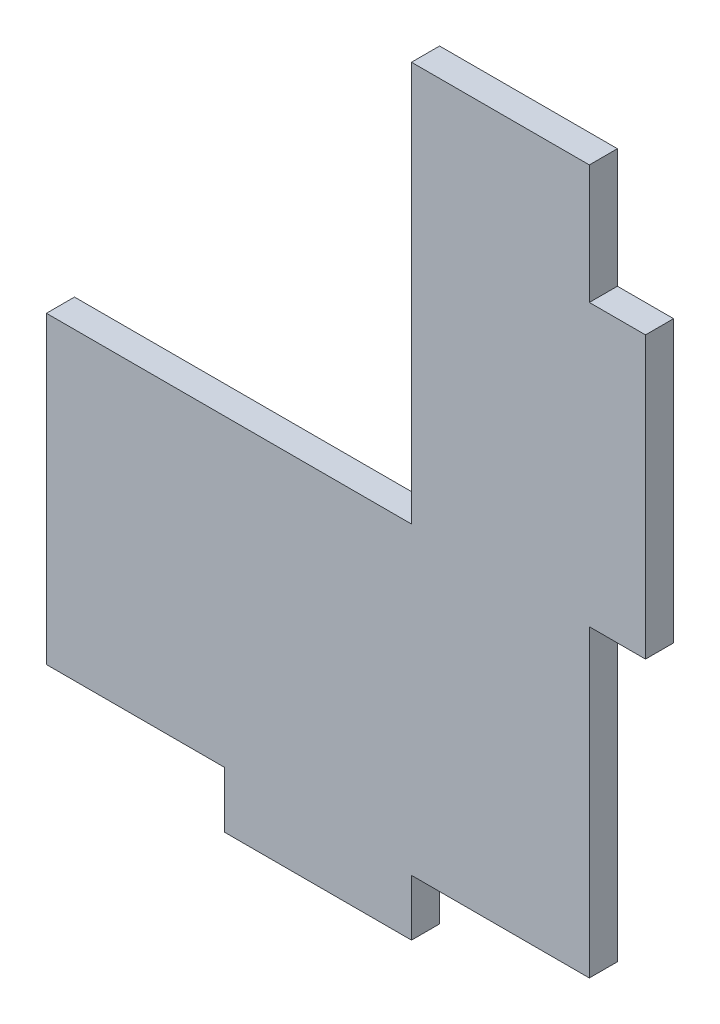
ISO-10303-21;
HEADER;
FILE_DESCRIPTION(('STEP AP214'),'2;1');
FILE_NAME('part.step','',(''),(''),'','','');
FILE_SCHEMA(('AUTOMOTIVE_DESIGN { 1 0 10303 214 1 1 1 1 }'));
ENDSEC;
DATA;
#1=APPLICATION_CONTEXT('core data for automotive mechanical design processes');
#2=APPLICATION_PROTOCOL_DEFINITION('international standard','automotive_design',2000,#1);
#3=PRODUCT_CONTEXT('',#1,'mechanical');
#4=PRODUCT('Part','Part','',(#3));
#5=PRODUCT_RELATED_PRODUCT_CATEGORY('part','',(#4));
#6=PRODUCT_DEFINITION_FORMATION('','',#4);
#7=PRODUCT_DEFINITION_CONTEXT('part definition',#1,'design');
#8=PRODUCT_DEFINITION('design','',#6,#7);
#9=PRODUCT_DEFINITION_SHAPE('','',#8);
#10=(LENGTH_UNIT() NAMED_UNIT(*) SI_UNIT(.MILLI.,.METRE.));
#11=(NAMED_UNIT(*) PLANE_ANGLE_UNIT() SI_UNIT($,.RADIAN.));
#12=(NAMED_UNIT(*) SI_UNIT($,.STERADIAN.) SOLID_ANGLE_UNIT());
#13=UNCERTAINTY_MEASURE_WITH_UNIT(LENGTH_MEASURE(1.E-05),#10,'distance_accuracy_value','');
#14=(GEOMETRIC_REPRESENTATION_CONTEXT(3) GLOBAL_UNCERTAINTY_ASSIGNED_CONTEXT((#13)) GLOBAL_UNIT_ASSIGNED_CONTEXT((#10,
#11,#12)) REPRESENTATION_CONTEXT('',''));
#15=CARTESIAN_POINT('',(0.,0.,0.));
#16=DIRECTION('',(0.,0.,1.));
#17=DIRECTION('',(1.,0.,0.));
#18=AXIS2_PLACEMENT_3D('',#15,#16,#17);
#19=CARTESIAN_POINT('',(0.,0.,3.));
#20=DIRECTION('',(-1.,0.,0.));
#21=DIRECTION('',(0.,0.,1.));
#22=AXIS2_PLACEMENT_3D('',#19,#20,#21);
#23=PLANE('',#22);
#24=DIRECTION('',(0.,1.,0.));
#25=VECTOR('',#24,1.);
#26=CARTESIAN_POINT('',(0.,0.,3.));
#27=LINE('',#26,#25);
#28=CARTESIAN_POINT('',(0.,38.5,3.));
#29=VERTEX_POINT('',#28);
#30=CARTESIAN_POINT('',(0.,68.5,3.));
#31=VERTEX_POINT('',#30);
#32=EDGE_CURVE('E240',#29,#31,#27,.T.);
#33=ORIENTED_EDGE('',*,*,#32,.F.);
#34=DIRECTION('',(0.,0.,-1.));
#35=VECTOR('',#34,1.);
#36=CARTESIAN_POINT('',(0.,38.5,3.));
#37=LINE('',#36,#35);
#38=CARTESIAN_POINT('',(0.,38.5,0.));
#39=VERTEX_POINT('',#38);
#40=EDGE_CURVE('E192',#29,#39,#37,.T.);
#41=ORIENTED_EDGE('',*,*,#40,.T.);
#42=DIRECTION('',(0.,1.,0.));
#43=VECTOR('',#42,1.);
#44=CARTESIAN_POINT('',(0.,0.,0.));
#45=LINE('',#44,#43);
#46=CARTESIAN_POINT('',(0.,68.5,0.));
#47=VERTEX_POINT('',#46);
#48=EDGE_CURVE('E57',#39,#47,#45,.T.);
#49=ORIENTED_EDGE('',*,*,#48,.T.);
#50=DIRECTION('',(0.,0.,-1.));
#51=VECTOR('',#50,1.);
#52=CARTESIAN_POINT('',(0.,68.5,3.));
#53=LINE('',#52,#51);
#54=EDGE_CURVE('E232',#31,#47,#53,.T.);
#55=ORIENTED_EDGE('',*,*,#54,.F.);
#56=EDGE_LOOP('',(#33,#41,#49,#55));
#57=FACE_BOUND('',#56,.T.);
#58=ADVANCED_FACE('F35',(#57),#23,.F.);
#59=CARTESIAN_POINT('',(0.,0.,3.));
#60=DIRECTION('',(0.,1.,0.));
#61=DIRECTION('',(-1.,0.,0.));
#62=AXIS2_PLACEMENT_3D('',#59,#60,#61);
#63=PLANE('',#62);
#64=DIRECTION('',(1.,0.,0.));
#65=VECTOR('',#64,1.);
#66=CARTESIAN_POINT('',(0.,0.,0.));
#67=LINE('',#66,#65);
#68=CARTESIAN_POINT('',(-45.,0.,0.));
#69=VERTEX_POINT('',#68);
#70=CARTESIAN_POINT('',(-25.,0.,0.));
#71=VERTEX_POINT('',#70);
#72=EDGE_CURVE('E243',#69,#71,#67,.T.);
#73=ORIENTED_EDGE('',*,*,#72,.T.);
#74=DIRECTION('',(0.,0.,-1.));
#75=VECTOR('',#74,1.);
#76=CARTESIAN_POINT('',(-25.,0.,3.));
#77=LINE('',#76,#75);
#78=CARTESIAN_POINT('',(-25.,0.,3.));
#79=VERTEX_POINT('',#78);
#80=EDGE_CURVE('E49',#79,#71,#77,.T.);
#81=ORIENTED_EDGE('',*,*,#80,.F.);
#82=DIRECTION('',(1.,0.,0.));
#83=VECTOR('',#82,1.);
#84=CARTESIAN_POINT('',(0.,0.,3.));
#85=LINE('',#84,#83);
#86=CARTESIAN_POINT('',(-45.,0.,3.));
#87=VERTEX_POINT('',#86);
#88=EDGE_CURVE('E242',#87,#79,#85,.T.);
#89=ORIENTED_EDGE('',*,*,#88,.F.);
#90=DIRECTION('',(0.,0.,-1.));
#91=VECTOR('',#90,1.);
#92=CARTESIAN_POINT('',(-45.,0.,3.));
#93=LINE('',#92,#91);
#94=EDGE_CURVE('E217',#87,#69,#93,.T.);
#95=ORIENTED_EDGE('',*,*,#94,.T.);
#96=EDGE_LOOP('',(#73,#81,#89,#95));
#97=FACE_BOUND('',#96,.T.);
#98=ADVANCED_FACE('F276',(#97),#63,.F.);
#99=CARTESIAN_POINT('',(0.,0.,3.));
#100=DIRECTION('',(0.,0.,1.));
#101=DIRECTION('',(1.,0.,0.));
#102=AXIS2_PLACEMENT_3D('',#99,#100,#101);
#103=PLANE('',#102);
#104=DIRECTION('',(1.,0.,0.));
#105=VECTOR('',#104,1.);
#106=CARTESIAN_POINT('',(-25.,81.2257154487709,3.));
#107=LINE('',#106,#105);
#108=CARTESIAN_POINT('',(-25.,81.2257154487709,3.));
#109=VERTEX_POINT('',#108);
#110=CARTESIAN_POINT('',(-6.,81.2257154487709,3.));
#111=VERTEX_POINT('',#110);
#112=EDGE_CURVE('E148',#109,#111,#107,.T.);
#113=ORIENTED_EDGE('',*,*,#112,.F.);
#114=DIRECTION('',(0.,1.,0.));
#115=VECTOR('',#114,1.);
#116=CARTESIAN_POINT('',(-25.,38.5,3.));
#117=LINE('',#116,#115);
#118=CARTESIAN_POINT('',(-25.,38.5,3.));
#119=VERTEX_POINT('',#118);
#120=EDGE_CURVE('E143',#119,#109,#117,.T.);
#121=ORIENTED_EDGE('',*,*,#120,.F.);
#122=DIRECTION('',(1.,0.,0.));
#123=VECTOR('',#122,1.);
#124=CARTESIAN_POINT('',(-70.,38.5,3.));
#125=LINE('',#124,#123);
#126=CARTESIAN_POINT('',(-64.,38.5,3.));
#127=VERTEX_POINT('',#126);
#128=EDGE_CURVE('E151',#127,#119,#125,.T.);
#129=ORIENTED_EDGE('',*,*,#128,.F.);
#130=DIRECTION('',(0.,-1.,0.));
#131=VECTOR('',#130,1.);
#132=CARTESIAN_POINT('',(-64.,6.,3.));
#133=LINE('',#132,#131);
#134=CARTESIAN_POINT('',(-64.,6.,3.));
#135=VERTEX_POINT('',#134);
#136=EDGE_CURVE('E202',#127,#135,#133,.T.);
#137=ORIENTED_EDGE('',*,*,#136,.T.);
#138=DIRECTION('',(1.,0.,0.));
#139=VECTOR('',#138,1.);
#140=CARTESIAN_POINT('',(-64.,6.,3.));
#141=LINE('',#140,#139);
#142=CARTESIAN_POINT('',(-45.,6.,3.));
#143=VERTEX_POINT('',#142);
#144=EDGE_CURVE('E204',#135,#143,#141,.T.);
#145=ORIENTED_EDGE('',*,*,#144,.T.);
#146=DIRECTION('',(0.,-1.,0.));
#147=VECTOR('',#146,1.);
#148=CARTESIAN_POINT('',(-45.,0.,3.));
#149=LINE('',#148,#147);
#150=EDGE_CURVE('E208',#143,#87,#149,.T.);
#151=ORIENTED_EDGE('',*,*,#150,.T.);
#152=ORIENTED_EDGE('',*,*,#88,.T.);
#153=DIRECTION('',(0.,1.,0.));
#154=VECTOR('',#153,1.);
#155=CARTESIAN_POINT('',(-25.,0.,3.));
#156=LINE('',#155,#154);
#157=CARTESIAN_POINT('',(-25.,6.,3.));
#158=VERTEX_POINT('',#157);
#159=EDGE_CURVE('E171',#79,#158,#156,.T.);
#160=ORIENTED_EDGE('',*,*,#159,.T.);
#161=DIRECTION('',(1.,0.,0.));
#162=VECTOR('',#161,1.);
#163=CARTESIAN_POINT('',(-6.,6.,3.));
#164=LINE('',#163,#162);
#165=CARTESIAN_POINT('',(-6.,6.,3.));
#166=VERTEX_POINT('',#165);
#167=EDGE_CURVE('E174',#158,#166,#164,.T.);
#168=ORIENTED_EDGE('',*,*,#167,.T.);
#169=DIRECTION('',(0.,1.,0.));
#170=VECTOR('',#169,1.);
#171=CARTESIAN_POINT('',(-6.,6.,3.));
#172=LINE('',#171,#170);
#173=CARTESIAN_POINT('',(-6.,38.5,3.));
#174=VERTEX_POINT('',#173);
#175=EDGE_CURVE('E178',#166,#174,#172,.T.);
#176=ORIENTED_EDGE('',*,*,#175,.T.);
#177=DIRECTION('',(1.,0.,0.));
#178=VECTOR('',#177,1.);
#179=CARTESIAN_POINT('',(0.,38.5,3.));
#180=LINE('',#179,#178);
#181=EDGE_CURVE('E181',#174,#29,#180,.T.);
#182=ORIENTED_EDGE('',*,*,#181,.T.);
#183=ORIENTED_EDGE('',*,*,#32,.T.);
#184=DIRECTION('',(-1.,0.,0.));
#185=VECTOR('',#184,1.);
#186=CARTESIAN_POINT('',(0.,68.5,3.));
#187=LINE('',#186,#185);
#188=CARTESIAN_POINT('',(-6.00000000000001,68.5,3.));
#189=VERTEX_POINT('',#188);
#190=EDGE_CURVE('E226',#31,#189,#187,.T.);
#191=ORIENTED_EDGE('',*,*,#190,.T.);
#192=DIRECTION('',(0.,1.,0.));
#193=VECTOR('',#192,1.);
#194=CARTESIAN_POINT('',(-6.,104.,3.));
#195=LINE('',#194,#193);
#196=EDGE_CURVE('E229',#189,#111,#195,.T.);
#197=ORIENTED_EDGE('',*,*,#196,.T.);
#198=EDGE_LOOP('',(#113,#121,#129,#137,#145,#151,#152,#160,#168,#176,#182,#183,#191,#197));
#199=FACE_BOUND('',#198,.T.);
#200=ADVANCED_FACE('F159',(#199),#103,.T.);
#201=CARTESIAN_POINT('',(0.,0.,0.));
#202=DIRECTION('',(0.,0.,1.));
#203=DIRECTION('',(1.,0.,0.));
#204=AXIS2_PLACEMENT_3D('',#201,#202,#203);
#205=PLANE('',#204);
#206=DIRECTION('',(0.,1.,0.));
#207=VECTOR('',#206,1.);
#208=CARTESIAN_POINT('',(-25.,0.,0.));
#209=LINE('',#208,#207);
#210=CARTESIAN_POINT('',(-25.,38.5,0.));
#211=VERTEX_POINT('',#210);
#212=CARTESIAN_POINT('',(-25.,81.2257154487709,0.));
#213=VERTEX_POINT('',#212);
#214=EDGE_CURVE('E11',#211,#213,#209,.T.);
#215=ORIENTED_EDGE('',*,*,#214,.T.);
#216=DIRECTION('',(1.,0.,0.));
#217=VECTOR('',#216,1.);
#218=CARTESIAN_POINT('',(0.,81.2257154487709,0.));
#219=LINE('',#218,#217);
#220=CARTESIAN_POINT('',(-6.,81.2257154487709,0.));
#221=VERTEX_POINT('',#220);
#222=EDGE_CURVE('E167',#213,#221,#219,.T.);
#223=ORIENTED_EDGE('',*,*,#222,.T.);
#224=DIRECTION('',(0.,1.,0.));
#225=VECTOR('',#224,1.);
#226=CARTESIAN_POINT('',(-6.,104.,0.));
#227=LINE('',#226,#225);
#228=CARTESIAN_POINT('',(-6.00000000000001,68.5,0.));
#229=VERTEX_POINT('',#228);
#230=EDGE_CURVE('E230',#229,#221,#227,.T.);
#231=ORIENTED_EDGE('',*,*,#230,.F.);
#232=DIRECTION('',(-1.,0.,0.));
#233=VECTOR('',#232,1.);
#234=CARTESIAN_POINT('',(0.,68.5,0.));
#235=LINE('',#234,#233);
#236=EDGE_CURVE('E220',#47,#229,#235,.T.);
#237=ORIENTED_EDGE('',*,*,#236,.F.);
#238=ORIENTED_EDGE('',*,*,#48,.F.);
#239=DIRECTION('',(1.,0.,0.));
#240=VECTOR('',#239,1.);
#241=CARTESIAN_POINT('',(0.,38.5,0.));
#242=LINE('',#241,#240);
#243=CARTESIAN_POINT('',(-6.,38.5,0.));
#244=VERTEX_POINT('',#243);
#245=EDGE_CURVE('E175',#244,#39,#242,.T.);
#246=ORIENTED_EDGE('',*,*,#245,.F.);
#247=DIRECTION('',(0.,1.,0.));
#248=VECTOR('',#247,1.);
#249=CARTESIAN_POINT('',(-6.,6.,0.));
#250=LINE('',#249,#248);
#251=CARTESIAN_POINT('',(-6.,6.,0.));
#252=VERTEX_POINT('',#251);
#253=EDGE_CURVE('E188',#252,#244,#250,.T.);
#254=ORIENTED_EDGE('',*,*,#253,.F.);
#255=DIRECTION('',(1.,0.,0.));
#256=VECTOR('',#255,1.);
#257=CARTESIAN_POINT('',(-6.,6.,0.));
#258=LINE('',#257,#256);
#259=CARTESIAN_POINT('',(-25.,6.,0.));
#260=VERTEX_POINT('',#259);
#261=EDGE_CURVE('E185',#260,#252,#258,.T.);
#262=ORIENTED_EDGE('',*,*,#261,.F.);
#263=DIRECTION('',(0.,1.,0.));
#264=VECTOR('',#263,1.);
#265=CARTESIAN_POINT('',(-25.,0.,0.));
#266=LINE('',#265,#264);
#267=EDGE_CURVE('E170',#71,#260,#266,.T.);
#268=ORIENTED_EDGE('',*,*,#267,.F.);
#269=ORIENTED_EDGE('',*,*,#72,.F.);
#270=DIRECTION('',(0.,-1.,0.));
#271=VECTOR('',#270,1.);
#272=CARTESIAN_POINT('',(-45.,0.,0.));
#273=LINE('',#272,#271);
#274=CARTESIAN_POINT('',(-45.,6.,0.));
#275=VERTEX_POINT('',#274);
#276=EDGE_CURVE('E205',#275,#69,#273,.T.);
#277=ORIENTED_EDGE('',*,*,#276,.F.);
#278=DIRECTION('',(1.,0.,0.));
#279=VECTOR('',#278,1.);
#280=CARTESIAN_POINT('',(-64.,6.,0.));
#281=LINE('',#280,#279);
#282=CARTESIAN_POINT('',(-64.,6.,0.));
#283=VERTEX_POINT('',#282);
#284=EDGE_CURVE('E213',#283,#275,#281,.T.);
#285=ORIENTED_EDGE('',*,*,#284,.F.);
#286=DIRECTION('',(0.,-1.,0.));
#287=VECTOR('',#286,1.);
#288=CARTESIAN_POINT('',(-64.,6.,0.));
#289=LINE('',#288,#287);
#290=CARTESIAN_POINT('',(-64.,38.5,0.));
#291=VERTEX_POINT('',#290);
#292=EDGE_CURVE('E194',#291,#283,#289,.T.);
#293=ORIENTED_EDGE('',*,*,#292,.F.);
#294=DIRECTION('',(1.,0.,0.));
#295=VECTOR('',#294,1.);
#296=CARTESIAN_POINT('',(0.,38.5,0.));
#297=LINE('',#296,#295);
#298=EDGE_CURVE('E164',#291,#211,#297,.T.);
#299=ORIENTED_EDGE('',*,*,#298,.T.);
#300=EDGE_LOOP('',(#215,#223,#231,#237,#238,#246,#254,#262,#268,#269,#277,#285,#293,#299));
#301=FACE_BOUND('',#300,.T.);
#302=ADVANCED_FACE('F263',(#301),#205,.F.);
#303=CARTESIAN_POINT('',(-6.,104.,3.));
#304=DIRECTION('',(-1.,0.,0.));
#305=DIRECTION('',(0.,-1.,0.));
#306=AXIS2_PLACEMENT_3D('',#303,#304,#305);
#307=PLANE('',#306);
#308=ORIENTED_EDGE('',*,*,#230,.T.);
#309=DIRECTION('',(0.,0.,1.));
#310=VECTOR('',#309,1.);
#311=CARTESIAN_POINT('',(-6.,81.2257154487709,3.));
#312=LINE('',#311,#310);
#313=EDGE_CURVE('E42',#221,#111,#312,.T.);
#314=ORIENTED_EDGE('',*,*,#313,.T.);
#315=ORIENTED_EDGE('',*,*,#196,.F.);
#316=DIRECTION('',(0.,0.,-1.));
#317=VECTOR('',#316,1.);
#318=CARTESIAN_POINT('',(-6.00000000000001,68.5,3.));
#319=LINE('',#318,#317);
#320=EDGE_CURVE('E237',#189,#229,#319,.T.);
#321=ORIENTED_EDGE('',*,*,#320,.T.);
#322=EDGE_LOOP('',(#308,#314,#315,#321));
#323=FACE_BOUND('',#322,.T.);
#324=ADVANCED_FACE('F251',(#323),#307,.F.);
#325=CARTESIAN_POINT('',(0.,68.5,3.));
#326=DIRECTION('',(0.,-1.,0.));
#327=DIRECTION('',(0.,0.,-1.));
#328=AXIS2_PLACEMENT_3D('',#325,#326,#327);
#329=PLANE('',#328);
#330=ORIENTED_EDGE('',*,*,#236,.T.);
#331=ORIENTED_EDGE('',*,*,#320,.F.);
#332=ORIENTED_EDGE('',*,*,#190,.F.);
#333=ORIENTED_EDGE('',*,*,#54,.T.);
#334=EDGE_LOOP('',(#330,#331,#332,#333));
#335=FACE_BOUND('',#334,.T.);
#336=ADVANCED_FACE('F257',(#335),#329,.F.);
#337=CARTESIAN_POINT('',(-45.,0.,3.));
#338=DIRECTION('',(1.,0.,0.));
#339=DIRECTION('',(0.,0.,-1.));
#340=AXIS2_PLACEMENT_3D('',#337,#338,#339);
#341=PLANE('',#340);
#342=ORIENTED_EDGE('',*,*,#276,.T.);
#343=ORIENTED_EDGE('',*,*,#94,.F.);
#344=ORIENTED_EDGE('',*,*,#150,.F.);
#345=DIRECTION('',(0.,0.,-1.));
#346=VECTOR('',#345,1.);
#347=CARTESIAN_POINT('',(-45.,6.,3.));
#348=LINE('',#347,#346);
#349=EDGE_CURVE('E221',#143,#275,#348,.T.);
#350=ORIENTED_EDGE('',*,*,#349,.T.);
#351=EDGE_LOOP('',(#342,#343,#344,#350));
#352=FACE_BOUND('',#351,.T.);
#353=ADVANCED_FACE('F291',(#352),#341,.F.);
#354=CARTESIAN_POINT('',(-64.,6.,3.));
#355=DIRECTION('',(0.,1.,0.));
#356=DIRECTION('',(-1.,0.,0.));
#357=AXIS2_PLACEMENT_3D('',#354,#355,#356);
#358=PLANE('',#357);
#359=ORIENTED_EDGE('',*,*,#284,.T.);
#360=ORIENTED_EDGE('',*,*,#349,.F.);
#361=ORIENTED_EDGE('',*,*,#144,.F.);
#362=DIRECTION('',(0.,0.,-1.));
#363=VECTOR('',#362,1.);
#364=CARTESIAN_POINT('',(-64.,6.,3.));
#365=LINE('',#364,#363);
#366=EDGE_CURVE('E223',#135,#283,#365,.T.);
#367=ORIENTED_EDGE('',*,*,#366,.T.);
#368=EDGE_LOOP('',(#359,#360,#361,#367));
#369=FACE_BOUND('',#368,.T.);
#370=ADVANCED_FACE('F298',(#369),#358,.F.);
#371=CARTESIAN_POINT('',(-64.,6.,3.));
#372=DIRECTION('',(1.,0.,0.));
#373=DIRECTION('',(0.,0.,-1.));
#374=AXIS2_PLACEMENT_3D('',#371,#372,#373);
#375=PLANE('',#374);
#376=ORIENTED_EDGE('',*,*,#292,.T.);
#377=ORIENTED_EDGE('',*,*,#366,.F.);
#378=ORIENTED_EDGE('',*,*,#136,.F.);
#379=DIRECTION('',(0.,0.,-1.));
#380=VECTOR('',#379,1.);
#381=CARTESIAN_POINT('',(-64.,38.5,3.));
#382=LINE('',#381,#380);
#383=EDGE_CURVE('E154',#127,#291,#382,.T.);
#384=ORIENTED_EDGE('',*,*,#383,.T.);
#385=EDGE_LOOP('',(#376,#377,#378,#384));
#386=FACE_BOUND('',#385,.T.);
#387=ADVANCED_FACE('F294',(#386),#375,.F.);
#388=CARTESIAN_POINT('',(0.,38.5,3.));
#389=DIRECTION('',(0.,1.,0.));
#390=DIRECTION('',(0.,0.,1.));
#391=AXIS2_PLACEMENT_3D('',#388,#389,#390);
#392=PLANE('',#391);
#393=ORIENTED_EDGE('',*,*,#245,.T.);
#394=ORIENTED_EDGE('',*,*,#40,.F.);
#395=ORIENTED_EDGE('',*,*,#181,.F.);
#396=DIRECTION('',(0.,0.,-1.));
#397=VECTOR('',#396,1.);
#398=CARTESIAN_POINT('',(-6.,38.5,3.));
#399=LINE('',#398,#397);
#400=EDGE_CURVE('E195',#174,#244,#399,.T.);
#401=ORIENTED_EDGE('',*,*,#400,.T.);
#402=EDGE_LOOP('',(#393,#394,#395,#401));
#403=FACE_BOUND('',#402,.T.);
#404=ADVANCED_FACE('F297',(#403),#392,.F.);
#405=CARTESIAN_POINT('',(-6.,6.,3.));
#406=DIRECTION('',(-1.,0.,0.));
#407=DIRECTION('',(0.,0.,1.));
#408=AXIS2_PLACEMENT_3D('',#405,#406,#407);
#409=PLANE('',#408);
#410=ORIENTED_EDGE('',*,*,#253,.T.);
#411=ORIENTED_EDGE('',*,*,#400,.F.);
#412=ORIENTED_EDGE('',*,*,#175,.F.);
#413=DIRECTION('',(0.,0.,-1.));
#414=VECTOR('',#413,1.);
#415=CARTESIAN_POINT('',(-6.,6.,3.));
#416=LINE('',#415,#414);
#417=EDGE_CURVE('E197',#166,#252,#416,.T.);
#418=ORIENTED_EDGE('',*,*,#417,.T.);
#419=EDGE_LOOP('',(#410,#411,#412,#418));
#420=FACE_BOUND('',#419,.T.);
#421=ADVANCED_FACE('F311',(#420),#409,.F.);
#422=CARTESIAN_POINT('',(-6.,6.,3.));
#423=DIRECTION('',(0.,1.,0.));
#424=DIRECTION('',(0.,0.,1.));
#425=AXIS2_PLACEMENT_3D('',#422,#423,#424);
#426=PLANE('',#425);
#427=ORIENTED_EDGE('',*,*,#261,.T.);
#428=ORIENTED_EDGE('',*,*,#417,.F.);
#429=ORIENTED_EDGE('',*,*,#167,.F.);
#430=DIRECTION('',(0.,0.,-1.));
#431=VECTOR('',#430,1.);
#432=CARTESIAN_POINT('',(-25.,6.,3.));
#433=LINE('',#432,#431);
#434=EDGE_CURVE('E199',#158,#260,#433,.T.);
#435=ORIENTED_EDGE('',*,*,#434,.T.);
#436=EDGE_LOOP('',(#427,#428,#429,#435));
#437=FACE_BOUND('',#436,.T.);
#438=ADVANCED_FACE('F308',(#437),#426,.F.);
#439=CARTESIAN_POINT('',(-25.,0.,3.));
#440=DIRECTION('',(-1.,0.,0.));
#441=DIRECTION('',(0.,0.,1.));
#442=AXIS2_PLACEMENT_3D('',#439,#440,#441);
#443=PLANE('',#442);
#444=ORIENTED_EDGE('',*,*,#267,.T.);
#445=ORIENTED_EDGE('',*,*,#434,.F.);
#446=ORIENTED_EDGE('',*,*,#159,.F.);
#447=ORIENTED_EDGE('',*,*,#80,.T.);
#448=EDGE_LOOP('',(#444,#445,#446,#447));
#449=FACE_BOUND('',#448,.T.);
#450=ADVANCED_FACE('F273',(#449),#443,.F.);
#451=CARTESIAN_POINT('',(-25.,38.5,-7.));
#452=DIRECTION('',(1.,0.,0.));
#453=DIRECTION('',(0.,0.,-1.));
#454=AXIS2_PLACEMENT_3D('',#451,#452,#453);
#455=PLANE('',#454);
#456=DIRECTION('',(0.,0.,1.));
#457=VECTOR('',#456,1.);
#458=CARTESIAN_POINT('',(-25.,38.5,-7.));
#459=LINE('',#458,#457);
#460=EDGE_CURVE('E138',#211,#119,#459,.T.);
#461=ORIENTED_EDGE('',*,*,#460,.T.);
#462=ORIENTED_EDGE('',*,*,#120,.T.);
#463=DIRECTION('',(0.,0.,1.));
#464=VECTOR('',#463,1.);
#465=CARTESIAN_POINT('',(-25.,81.2257154487709,-7.));
#466=LINE('',#465,#464);
#467=EDGE_CURVE('E147',#213,#109,#466,.T.);
#468=ORIENTED_EDGE('',*,*,#467,.F.);
#469=ORIENTED_EDGE('',*,*,#214,.F.);
#470=EDGE_LOOP('',(#461,#462,#468,#469));
#471=FACE_BOUND('',#470,.T.);
#472=ADVANCED_FACE('F140',(#471),#455,.F.);
#473=CARTESIAN_POINT('',(-25.,81.2257154487709,-7.));
#474=DIRECTION('',(0.,-1.,0.));
#475=DIRECTION('',(0.,0.,-1.));
#476=AXIS2_PLACEMENT_3D('',#473,#474,#475);
#477=PLANE('',#476);
#478=ORIENTED_EDGE('',*,*,#467,.T.);
#479=ORIENTED_EDGE('',*,*,#112,.T.);
#480=ORIENTED_EDGE('',*,*,#313,.F.);
#481=ORIENTED_EDGE('',*,*,#222,.F.);
#482=EDGE_LOOP('',(#478,#479,#480,#481));
#483=FACE_BOUND('',#482,.T.);
#484=ADVANCED_FACE('F265',(#483),#477,.F.);
#485=CARTESIAN_POINT('',(-70.,38.5,-7.));
#486=DIRECTION('',(0.,-1.,0.));
#487=DIRECTION('',(0.,0.,-1.));
#488=AXIS2_PLACEMENT_3D('',#485,#486,#487);
#489=PLANE('',#488);
#490=ORIENTED_EDGE('',*,*,#383,.F.);
#491=ORIENTED_EDGE('',*,*,#128,.T.);
#492=ORIENTED_EDGE('',*,*,#460,.F.);
#493=ORIENTED_EDGE('',*,*,#298,.F.);
#494=EDGE_LOOP('',(#490,#491,#492,#493));
#495=FACE_BOUND('',#494,.T.);
#496=ADVANCED_FACE('F152',(#495),#489,.F.);
#497=CLOSED_SHELL('',(#58,#98,#200,#302,#324,#336,#353,#370,#387,#404,#421,#438,#450,#472,#484,#496));
#498=MANIFOLD_SOLID_BREP('B2',#497);
#499=ADVANCED_BREP_SHAPE_REPRESENTATION('',(#18,#498),#14);
#500=SHAPE_DEFINITION_REPRESENTATION(#9,#499);
ENDSEC;
END-ISO-10303-21;
